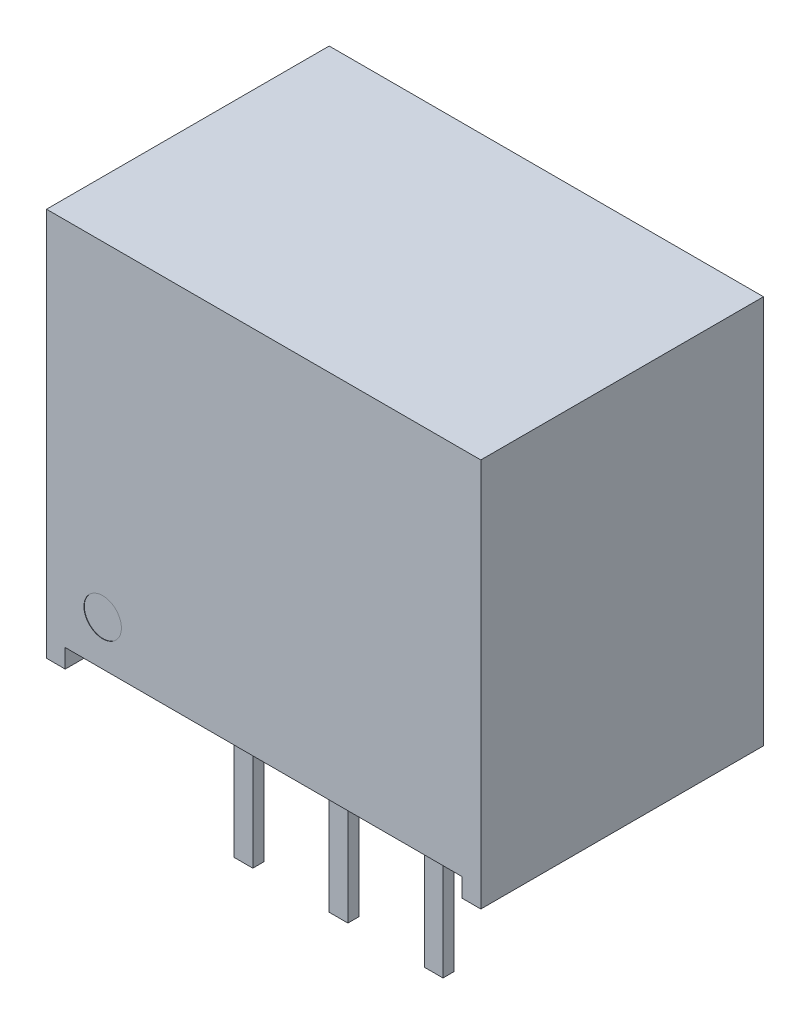
ISO-10303-21;
HEADER;
FILE_DESCRIPTION(('STEP AP214'),'2;1');
FILE_NAME('part.step','',(''),(''),'','','');
FILE_SCHEMA(('AUTOMOTIVE_DESIGN { 1 0 10303 214 1 1 1 1 }'));
ENDSEC;
DATA;
#1=APPLICATION_CONTEXT('core data for automotive mechanical design processes');
#2=APPLICATION_PROTOCOL_DEFINITION('international standard','automotive_design',2000,#1);
#3=PRODUCT_CONTEXT('',#1,'mechanical');
#4=PRODUCT('Part','Part','',(#3));
#5=PRODUCT_RELATED_PRODUCT_CATEGORY('part','',(#4));
#6=PRODUCT_DEFINITION_FORMATION('','',#4);
#7=PRODUCT_DEFINITION_CONTEXT('part definition',#1,'design');
#8=PRODUCT_DEFINITION('design','',#6,#7);
#9=PRODUCT_DEFINITION_SHAPE('','',#8);
#10=(LENGTH_UNIT() NAMED_UNIT(*) SI_UNIT(.MILLI.,.METRE.));
#11=(NAMED_UNIT(*) PLANE_ANGLE_UNIT() SI_UNIT($,.RADIAN.));
#12=(NAMED_UNIT(*) SI_UNIT($,.STERADIAN.) SOLID_ANGLE_UNIT());
#13=UNCERTAINTY_MEASURE_WITH_UNIT(LENGTH_MEASURE(1.E-05),#10,'distance_accuracy_value','');
#14=(GEOMETRIC_REPRESENTATION_CONTEXT(3) GLOBAL_UNCERTAINTY_ASSIGNED_CONTEXT((#13)) GLOBAL_UNIT_ASSIGNED_CONTEXT((#10,
#11,#12)) REPRESENTATION_CONTEXT('',''));
#15=CARTESIAN_POINT('',(0.,0.,0.));
#16=DIRECTION('',(0.,0.,1.));
#17=DIRECTION('',(1.,0.,0.));
#18=AXIS2_PLACEMENT_3D('',#15,#16,#17);
#19=CARTESIAN_POINT('',(-0.25,-4.6,5.55));
#20=DIRECTION('',(1.,0.,0.));
#21=DIRECTION('',(0.,0.,-1.));
#22=AXIS2_PLACEMENT_3D('',#19,#20,#21);
#23=PLANE('',#22);
#24=DIRECTION('',(0.,1.,0.));
#25=VECTOR('',#24,1.);
#26=CARTESIAN_POINT('',(-0.249999999999999,-4.6,5.25));
#27=LINE('',#26,#25);
#28=CARTESIAN_POINT('',(-0.25,0.,5.25));
#29=VERTEX_POINT('',#28);
#30=CARTESIAN_POINT('',(-0.249999999999999,-4.6,5.25));
#31=VERTEX_POINT('',#30);
#32=EDGE_CURVE('P0_E140',#29,#31,#27,.F.);
#33=ORIENTED_EDGE('',*,*,#32,.T.);
#34=DIRECTION('',(0.,0.,-1.));
#35=VECTOR('',#34,1.);
#36=CARTESIAN_POINT('',(-0.25,-4.6,0.));
#37=LINE('',#36,#35);
#38=CARTESIAN_POINT('',(-0.25,-4.6,5.55));
#39=VERTEX_POINT('',#38);
#40=EDGE_CURVE('P0_E319',#39,#31,#37,.T.);
#41=ORIENTED_EDGE('',*,*,#40,.F.);
#42=DIRECTION('',(0.,1.,0.));
#43=VECTOR('',#42,1.);
#44=CARTESIAN_POINT('',(-0.25,-4.6,5.55));
#45=LINE('',#44,#43);
#46=CARTESIAN_POINT('',(-0.25,0.,5.55));
#47=VERTEX_POINT('',#46);
#48=EDGE_CURVE('P0_E308',#39,#47,#45,.T.);
#49=ORIENTED_EDGE('',*,*,#48,.T.);
#50=DIRECTION('',(0.,0.,-1.));
#51=VECTOR('',#50,1.);
#52=CARTESIAN_POINT('',(-0.25,0.,5.55));
#53=LINE('',#52,#51);
#54=EDGE_CURVE('P0_E143',#29,#47,#53,.F.);
#55=ORIENTED_EDGE('',*,*,#54,.F.);
#56=EDGE_LOOP('',(#33,#41,#49,#55));
#57=FACE_BOUND('',#56,.T.);
#58=ADVANCED_FACE('P0_F39',(#57),#23,.F.);
#59=CARTESIAN_POINT('',(2.29,-4.6,5.55));
#60=DIRECTION('',(1.,0.,0.));
#61=DIRECTION('',(0.,0.,-1.));
#62=AXIS2_PLACEMENT_3D('',#59,#60,#61);
#63=PLANE('',#62);
#64=DIRECTION('',(0.,1.,0.));
#65=VECTOR('',#64,1.);
#66=CARTESIAN_POINT('',(2.29,-4.6,5.25));
#67=LINE('',#66,#65);
#68=CARTESIAN_POINT('',(2.29,0.,5.25));
#69=VERTEX_POINT('',#68);
#70=CARTESIAN_POINT('',(2.29,-4.6,5.25));
#71=VERTEX_POINT('',#70);
#72=EDGE_CURVE('P0_E302',#69,#71,#67,.F.);
#73=ORIENTED_EDGE('',*,*,#72,.T.);
#74=DIRECTION('',(0.,0.,-1.));
#75=VECTOR('',#74,1.);
#76=CARTESIAN_POINT('',(2.29,-4.6,0.));
#77=LINE('',#76,#75);
#78=CARTESIAN_POINT('',(2.29,-4.6,5.55));
#79=VERTEX_POINT('',#78);
#80=EDGE_CURVE('P0_E294',#79,#71,#77,.T.);
#81=ORIENTED_EDGE('',*,*,#80,.F.);
#82=DIRECTION('',(0.,1.,0.));
#83=VECTOR('',#82,1.);
#84=CARTESIAN_POINT('',(2.29,-4.6,5.55));
#85=LINE('',#84,#83);
#86=CARTESIAN_POINT('',(2.29,0.,5.55));
#87=VERTEX_POINT('',#86);
#88=EDGE_CURVE('P0_E282',#79,#87,#85,.T.);
#89=ORIENTED_EDGE('',*,*,#88,.T.);
#90=DIRECTION('',(0.,0.,-1.));
#91=VECTOR('',#90,1.);
#92=CARTESIAN_POINT('',(2.29,0.,5.55));
#93=LINE('',#92,#91);
#94=EDGE_CURVE('P0_E328',#69,#87,#93,.F.);
#95=ORIENTED_EDGE('',*,*,#94,.F.);
#96=EDGE_LOOP('',(#73,#81,#89,#95));
#97=FACE_BOUND('',#96,.T.);
#98=ADVANCED_FACE('P0_F424',(#97),#63,.F.);
#99=CARTESIAN_POINT('',(-4.3,1.2,7.54));
#100=DIRECTION('',(0.,0.,1.));
#101=DIRECTION('',(1.,0.,0.));
#102=AXIS2_PLACEMENT_3D('',#99,#100,#101);
#103=PLANE('',#102);
#104=CARTESIAN_POINT('',(-4.3,1.2,7.54));
#105=DIRECTION('',(0.,0.,1.));
#106=DIRECTION('',(1.,0.,0.));
#107=AXIS2_PLACEMENT_3D('',#104,#105,#106);
#108=CIRCLE('',#107,0.5);
#109=CARTESIAN_POINT('',(-3.8,1.2,7.54));
#110=VERTEX_POINT('',#109);
#111=EDGE_CURVE('P0_E42',#110,#110,#108,.T.);
#112=ORIENTED_EDGE('',*,*,#111,.T.);
#113=EDGE_LOOP('',(#112));
#114=FACE_BOUND('',#113,.T.);
#115=ADVANCED_FACE('P0_F422',(#114),#103,.T.);
#116=CARTESIAN_POINT('',(-0.249999999999999,-4.6,5.25));
#117=DIRECTION('',(0.,0.,1.));
#118=DIRECTION('',(1.,0.,0.));
#119=AXIS2_PLACEMENT_3D('',#116,#117,#118);
#120=PLANE('',#119);
#121=DIRECTION('',(0.,1.,0.));
#122=VECTOR('',#121,1.);
#123=CARTESIAN_POINT('',(0.250000000000001,-4.6,5.25));
#124=LINE('',#123,#122);
#125=CARTESIAN_POINT('',(0.250000000000001,0.,5.25));
#126=VERTEX_POINT('',#125);
#127=CARTESIAN_POINT('',(0.250000000000001,-4.6,5.25));
#128=VERTEX_POINT('',#127);
#129=EDGE_CURVE('P0_E274',#126,#128,#124,.F.);
#130=ORIENTED_EDGE('',*,*,#129,.T.);
#131=DIRECTION('',(1.,0.,0.));
#132=VECTOR('',#131,1.);
#133=CARTESIAN_POINT('',(2.54,-4.6,5.25));
#134=LINE('',#133,#132);
#135=EDGE_CURVE('P0_E315',#31,#128,#134,.T.);
#136=ORIENTED_EDGE('',*,*,#135,.F.);
#137=ORIENTED_EDGE('',*,*,#32,.F.);
#138=DIRECTION('',(1.,0.,0.));
#139=VECTOR('',#138,1.);
#140=CARTESIAN_POINT('',(-0.249999999999999,0.,5.25));
#141=LINE('',#140,#139);
#142=EDGE_CURVE('P0_E323',#126,#29,#141,.F.);
#143=ORIENTED_EDGE('',*,*,#142,.F.);
#144=EDGE_LOOP('',(#130,#136,#137,#143));
#145=FACE_BOUND('',#144,.T.);
#146=ADVANCED_FACE('P0_F374',(#145),#120,.F.);
#147=CARTESIAN_POINT('',(2.54,-4.6,0.));
#148=DIRECTION('',(0.,-1.,0.));
#149=DIRECTION('',(0.,0.,-1.));
#150=AXIS2_PLACEMENT_3D('',#147,#148,#149);
#151=PLANE('',#150);
#152=ORIENTED_EDGE('',*,*,#40,.T.);
#153=ORIENTED_EDGE('',*,*,#135,.T.);
#154=DIRECTION('',(0.,0.,1.));
#155=VECTOR('',#154,1.);
#156=CARTESIAN_POINT('',(0.250000000000001,-4.6,5.55));
#157=LINE('',#156,#155);
#158=CARTESIAN_POINT('',(0.250000000000001,-4.6,5.55));
#159=VERTEX_POINT('',#158);
#160=EDGE_CURVE('P0_E271',#128,#159,#157,.T.);
#161=ORIENTED_EDGE('',*,*,#160,.T.);
#162=DIRECTION('',(-1.,0.,0.));
#163=VECTOR('',#162,1.);
#164=CARTESIAN_POINT('',(-0.25,-4.6,5.55));
#165=LINE('',#164,#163);
#166=EDGE_CURVE('P0_E311',#159,#39,#165,.T.);
#167=ORIENTED_EDGE('',*,*,#166,.T.);
#168=EDGE_LOOP('',(#152,#153,#161,#167));
#169=FACE_BOUND('',#168,.T.);
#170=ADVANCED_FACE('P0_F377',(#169),#151,.T.);
#171=CARTESIAN_POINT('',(-0.25,-4.6,5.55));
#172=DIRECTION('',(0.,0.,-1.));
#173=DIRECTION('',(-1.,0.,0.));
#174=AXIS2_PLACEMENT_3D('',#171,#172,#173);
#175=PLANE('',#174);
#176=ORIENTED_EDGE('',*,*,#48,.F.);
#177=ORIENTED_EDGE('',*,*,#166,.F.);
#178=DIRECTION('',(0.,1.,0.));
#179=VECTOR('',#178,1.);
#180=CARTESIAN_POINT('',(0.250000000000001,-4.6,5.55));
#181=LINE('',#180,#179);
#182=CARTESIAN_POINT('',(0.250000000000001,0.,5.55));
#183=VERTEX_POINT('',#182);
#184=EDGE_CURVE('P0_E267',#159,#183,#181,.T.);
#185=ORIENTED_EDGE('',*,*,#184,.T.);
#186=DIRECTION('',(-1.,0.,0.));
#187=VECTOR('',#186,1.);
#188=CARTESIAN_POINT('',(-0.25,0.,5.55));
#189=LINE('',#188,#187);
#190=EDGE_CURVE('P0_E305',#47,#183,#189,.F.);
#191=ORIENTED_EDGE('',*,*,#190,.F.);
#192=EDGE_LOOP('',(#176,#177,#185,#191));
#193=FACE_BOUND('',#192,.T.);
#194=ADVANCED_FACE('P0_F382',(#193),#175,.F.);
#195=CARTESIAN_POINT('',(2.29,-4.6,5.25));
#196=DIRECTION('',(0.,0.,1.));
#197=DIRECTION('',(1.,0.,0.));
#198=AXIS2_PLACEMENT_3D('',#195,#196,#197);
#199=PLANE('',#198);
#200=DIRECTION('',(0.,1.,0.));
#201=VECTOR('',#200,1.);
#202=CARTESIAN_POINT('',(2.79,-4.6,5.25));
#203=LINE('',#202,#201);
#204=CARTESIAN_POINT('',(2.79,0.,5.25));
#205=VERTEX_POINT('',#204);
#206=CARTESIAN_POINT('',(2.79,-4.6,5.25));
#207=VERTEX_POINT('',#206);
#208=EDGE_CURVE('P0_E255',#205,#207,#203,.F.);
#209=ORIENTED_EDGE('',*,*,#208,.T.);
#210=DIRECTION('',(1.,0.,0.));
#211=VECTOR('',#210,1.);
#212=CARTESIAN_POINT('',(5.08,-4.6,5.25));
#213=LINE('',#212,#211);
#214=EDGE_CURVE('P0_E290',#71,#207,#213,.T.);
#215=ORIENTED_EDGE('',*,*,#214,.F.);
#216=ORIENTED_EDGE('',*,*,#72,.F.);
#217=DIRECTION('',(1.,0.,0.));
#218=VECTOR('',#217,1.);
#219=CARTESIAN_POINT('',(2.29,0.,5.25));
#220=LINE('',#219,#218);
#221=EDGE_CURVE('P0_E298',#205,#69,#220,.F.);
#222=ORIENTED_EDGE('',*,*,#221,.F.);
#223=EDGE_LOOP('',(#209,#215,#216,#222));
#224=FACE_BOUND('',#223,.T.);
#225=ADVANCED_FACE('P0_F411',(#224),#199,.F.);
#226=CARTESIAN_POINT('',(5.08,-4.6,0.));
#227=DIRECTION('',(0.,-1.,0.));
#228=DIRECTION('',(0.,0.,-1.));
#229=AXIS2_PLACEMENT_3D('',#226,#227,#228);
#230=PLANE('',#229);
#231=ORIENTED_EDGE('',*,*,#80,.T.);
#232=ORIENTED_EDGE('',*,*,#214,.T.);
#233=DIRECTION('',(0.,0.,1.));
#234=VECTOR('',#233,1.);
#235=CARTESIAN_POINT('',(2.79,-4.6,5.55));
#236=LINE('',#235,#234);
#237=CARTESIAN_POINT('',(2.79,-4.6,5.55));
#238=VERTEX_POINT('',#237);
#239=EDGE_CURVE('P0_E252',#207,#238,#236,.T.);
#240=ORIENTED_EDGE('',*,*,#239,.T.);
#241=DIRECTION('',(-1.,0.,0.));
#242=VECTOR('',#241,1.);
#243=CARTESIAN_POINT('',(2.29,-4.6,5.55));
#244=LINE('',#243,#242);
#245=EDGE_CURVE('P0_E286',#238,#79,#244,.T.);
#246=ORIENTED_EDGE('',*,*,#245,.T.);
#247=EDGE_LOOP('',(#231,#232,#240,#246));
#248=FACE_BOUND('',#247,.T.);
#249=ADVANCED_FACE('P0_F407',(#248),#230,.T.);
#250=CARTESIAN_POINT('',(2.29,-4.6,5.55));
#251=DIRECTION('',(0.,0.,-1.));
#252=DIRECTION('',(-1.,0.,0.));
#253=AXIS2_PLACEMENT_3D('',#250,#251,#252);
#254=PLANE('',#253);
#255=ORIENTED_EDGE('',*,*,#88,.F.);
#256=ORIENTED_EDGE('',*,*,#245,.F.);
#257=DIRECTION('',(0.,1.,0.));
#258=VECTOR('',#257,1.);
#259=CARTESIAN_POINT('',(2.79,-4.6,5.55));
#260=LINE('',#259,#258);
#261=CARTESIAN_POINT('',(2.79,0.,5.55));
#262=VERTEX_POINT('',#261);
#263=EDGE_CURVE('P0_E248',#238,#262,#260,.T.);
#264=ORIENTED_EDGE('',*,*,#263,.T.);
#265=DIRECTION('',(-1.,0.,0.));
#266=VECTOR('',#265,1.);
#267=CARTESIAN_POINT('',(2.29,0.,5.55));
#268=LINE('',#267,#266);
#269=EDGE_CURVE('P0_E279',#87,#262,#268,.F.);
#270=ORIENTED_EDGE('',*,*,#269,.F.);
#271=EDGE_LOOP('',(#255,#256,#264,#270));
#272=FACE_BOUND('',#271,.T.);
#273=ADVANCED_FACE('P0_F403',(#272),#254,.F.);
#274=CARTESIAN_POINT('',(-4.3,1.2,7.54));
#275=DIRECTION('',(0.,0.,1.));
#276=DIRECTION('',(1.,0.,0.));
#277=AXIS2_PLACEMENT_3D('',#274,#275,#276);
#278=CYLINDRICAL_SURFACE('',#277,0.5);
#279=ORIENTED_EDGE('',*,*,#111,.F.);
#280=EDGE_LOOP('',(#279));
#281=FACE_BOUND('',#280,.T.);
#282=CARTESIAN_POINT('',(-4.3,1.2,7.55));
#283=DIRECTION('',(0.,0.,1.));
#284=DIRECTION('',(1.,0.,0.));
#285=AXIS2_PLACEMENT_3D('',#282,#283,#284);
#286=CIRCLE('',#285,0.5);
#287=CARTESIAN_POINT('',(-3.8,1.2,7.55));
#288=VERTEX_POINT('',#287);
#289=EDGE_CURVE('P0_E241',#288,#288,#286,.T.);
#290=ORIENTED_EDGE('',*,*,#289,.T.);
#291=EDGE_LOOP('',(#290));
#292=FACE_BOUND('',#291,.T.);
#293=ADVANCED_FACE('P0_F336',(#281,#292),#278,.F.);
#294=CARTESIAN_POINT('',(5.3,-0.499999999999999,7.55));
#295=DIRECTION('',(0.,1.,0.));
#296=DIRECTION('',(-1.,0.,0.));
#297=AXIS2_PLACEMENT_3D('',#294,#295,#296);
#298=PLANE('',#297);
#299=DIRECTION('',(0.,0.,1.));
#300=VECTOR('',#299,1.);
#301=CARTESIAN_POINT('',(5.8,-0.499999999999999,7.55));
#302=LINE('',#301,#300);
#303=CARTESIAN_POINT('',(5.8,-0.499999999999999,0.));
#304=VERTEX_POINT('',#303);
#305=CARTESIAN_POINT('',(5.8,-0.499999999999999,7.55));
#306=VERTEX_POINT('',#305);
#307=EDGE_CURVE('P0_E226',#304,#306,#302,.T.);
#308=ORIENTED_EDGE('',*,*,#307,.T.);
#309=DIRECTION('',(-1.,0.,0.));
#310=VECTOR('',#309,1.);
#311=CARTESIAN_POINT('',(5.8,-0.499999999999999,7.55));
#312=LINE('',#311,#310);
#313=CARTESIAN_POINT('',(5.3,-0.499999999999999,7.55));
#314=VERTEX_POINT('',#313);
#315=EDGE_CURVE('P0_E238',#306,#314,#312,.T.);
#316=ORIENTED_EDGE('',*,*,#315,.T.);
#317=DIRECTION('',(0.,0.,-1.));
#318=VECTOR('',#317,1.);
#319=CARTESIAN_POINT('',(5.3,-0.499999999999999,7.55));
#320=LINE('',#319,#318);
#321=CARTESIAN_POINT('',(5.3,-0.499999999999999,0.));
#322=VERTEX_POINT('',#321);
#323=EDGE_CURVE('P0_E260',#314,#322,#320,.T.);
#324=ORIENTED_EDGE('',*,*,#323,.T.);
#325=DIRECTION('',(-1.,0.,0.));
#326=VECTOR('',#325,1.);
#327=CARTESIAN_POINT('',(5.3,-0.499999999999999,0.));
#328=LINE('',#327,#326);
#329=EDGE_CURVE('P0_E276',#304,#322,#328,.T.);
#330=ORIENTED_EDGE('',*,*,#329,.F.);
#331=EDGE_LOOP('',(#308,#316,#324,#330));
#332=FACE_BOUND('',#331,.T.);
#333=ADVANCED_FACE('P0_F388',(#332),#298,.F.);
#334=CARTESIAN_POINT('',(0.250000000000001,-4.6,5.55));
#335=DIRECTION('',(-1.,0.,0.));
#336=DIRECTION('',(0.,0.,1.));
#337=AXIS2_PLACEMENT_3D('',#334,#335,#336);
#338=PLANE('',#337);
#339=ORIENTED_EDGE('',*,*,#184,.F.);
#340=ORIENTED_EDGE('',*,*,#160,.F.);
#341=ORIENTED_EDGE('',*,*,#129,.F.);
#342=DIRECTION('',(0.,0.,1.));
#343=VECTOR('',#342,1.);
#344=CARTESIAN_POINT('',(0.25,0.,7.55));
#345=LINE('',#344,#343);
#346=EDGE_CURVE('P0_E220',#126,#183,#345,.T.);
#347=ORIENTED_EDGE('',*,*,#346,.T.);
#348=EDGE_LOOP('',(#339,#340,#341,#347));
#349=FACE_BOUND('',#348,.T.);
#350=ADVANCED_FACE('P0_F385',(#349),#338,.F.);
#351=CARTESIAN_POINT('',(-5.3,0.,7.55));
#352=DIRECTION('',(-1.,0.,0.));
#353=DIRECTION('',(0.,0.,1.));
#354=AXIS2_PLACEMENT_3D('',#351,#352,#353);
#355=PLANE('',#354);
#356=DIRECTION('',(0.,0.,1.));
#357=VECTOR('',#356,1.);
#358=CARTESIAN_POINT('',(-5.3,0.,7.55));
#359=LINE('',#358,#357);
#360=CARTESIAN_POINT('',(-5.3,0.,0.));
#361=VERTEX_POINT('',#360);
#362=CARTESIAN_POINT('',(-5.3,0.,7.55));
#363=VERTEX_POINT('',#362);
#364=EDGE_CURVE('P0_E217',#361,#363,#359,.T.);
#365=ORIENTED_EDGE('',*,*,#364,.T.);
#366=DIRECTION('',(0.,1.,0.));
#367=VECTOR('',#366,1.);
#368=CARTESIAN_POINT('',(-5.3,9.66,7.55));
#369=LINE('',#368,#367);
#370=CARTESIAN_POINT('',(-5.3,-0.499999999999999,7.55));
#371=VERTEX_POINT('',#370);
#372=EDGE_CURVE('P0_E232',#363,#371,#369,.F.);
#373=ORIENTED_EDGE('',*,*,#372,.T.);
#374=DIRECTION('',(0.,0.,1.));
#375=VECTOR('',#374,1.);
#376=CARTESIAN_POINT('',(-5.3,-0.499999999999999,7.55));
#377=LINE('',#376,#375);
#378=CARTESIAN_POINT('',(-5.3,-0.499999999999999,0.));
#379=VERTEX_POINT('',#378);
#380=EDGE_CURVE('P0_E244',#371,#379,#377,.F.);
#381=ORIENTED_EDGE('',*,*,#380,.T.);
#382=DIRECTION('',(0.,1.,0.));
#383=VECTOR('',#382,1.);
#384=CARTESIAN_POINT('',(-5.3,0.,0.));
#385=LINE('',#384,#383);
#386=EDGE_CURVE('P0_E264',#361,#379,#385,.F.);
#387=ORIENTED_EDGE('',*,*,#386,.F.);
#388=EDGE_LOOP('',(#365,#373,#381,#387));
#389=FACE_BOUND('',#388,.T.);
#390=ADVANCED_FACE('P0_F387',(#389),#355,.F.);
#391=CARTESIAN_POINT('',(5.3,0.,7.55));
#392=DIRECTION('',(1.,0.,0.));
#393=DIRECTION('',(0.,0.,-1.));
#394=AXIS2_PLACEMENT_3D('',#391,#392,#393);
#395=PLANE('',#394);
#396=ORIENTED_EDGE('',*,*,#323,.F.);
#397=DIRECTION('',(0.,1.,0.));
#398=VECTOR('',#397,1.);
#399=CARTESIAN_POINT('',(5.3,9.66,7.55));
#400=LINE('',#399,#398);
#401=CARTESIAN_POINT('',(5.3,0.,7.55));
#402=VERTEX_POINT('',#401);
#403=EDGE_CURVE('P0_E235',#314,#402,#400,.T.);
#404=ORIENTED_EDGE('',*,*,#403,.T.);
#405=DIRECTION('',(0.,0.,1.));
#406=VECTOR('',#405,1.);
#407=CARTESIAN_POINT('',(5.3,0.,7.55));
#408=LINE('',#407,#406);
#409=CARTESIAN_POINT('',(5.3,0.,0.));
#410=VERTEX_POINT('',#409);
#411=EDGE_CURVE('P0_E209',#402,#410,#408,.F.);
#412=ORIENTED_EDGE('',*,*,#411,.T.);
#413=DIRECTION('',(0.,1.,0.));
#414=VECTOR('',#413,1.);
#415=CARTESIAN_POINT('',(5.3,0.,0.));
#416=LINE('',#415,#414);
#417=EDGE_CURVE('P0_E258',#322,#410,#416,.T.);
#418=ORIENTED_EDGE('',*,*,#417,.F.);
#419=EDGE_LOOP('',(#396,#404,#412,#418));
#420=FACE_BOUND('',#419,.T.);
#421=ADVANCED_FACE('P0_F394',(#420),#395,.F.);
#422=CARTESIAN_POINT('',(2.79,-4.6,5.55));
#423=DIRECTION('',(-1.,0.,0.));
#424=DIRECTION('',(0.,0.,1.));
#425=AXIS2_PLACEMENT_3D('',#422,#423,#424);
#426=PLANE('',#425);
#427=ORIENTED_EDGE('',*,*,#263,.F.);
#428=ORIENTED_EDGE('',*,*,#239,.F.);
#429=ORIENTED_EDGE('',*,*,#208,.F.);
#430=DIRECTION('',(0.,0.,1.));
#431=VECTOR('',#430,1.);
#432=CARTESIAN_POINT('',(2.79,0.,7.55));
#433=LINE('',#432,#431);
#434=EDGE_CURVE('P0_E175',#205,#262,#433,.T.);
#435=ORIENTED_EDGE('',*,*,#434,.T.);
#436=EDGE_LOOP('',(#427,#428,#429,#435));
#437=FACE_BOUND('',#436,.T.);
#438=ADVANCED_FACE('P0_F347',(#437),#426,.F.);
#439=CARTESIAN_POINT('',(-5.3,-0.499999999999999,7.55));
#440=DIRECTION('',(0.,1.,0.));
#441=DIRECTION('',(-1.,0.,0.));
#442=AXIS2_PLACEMENT_3D('',#439,#440,#441);
#443=PLANE('',#442);
#444=ORIENTED_EDGE('',*,*,#380,.F.);
#445=DIRECTION('',(-1.,0.,0.));
#446=VECTOR('',#445,1.);
#447=CARTESIAN_POINT('',(5.8,-0.499999999999999,7.55));
#448=LINE('',#447,#446);
#449=CARTESIAN_POINT('',(-5.8,-0.499999999999999,7.55));
#450=VERTEX_POINT('',#449);
#451=EDGE_CURVE('P0_E229',#371,#450,#448,.T.);
#452=ORIENTED_EDGE('',*,*,#451,.T.);
#453=DIRECTION('',(0.,0.,-1.));
#454=VECTOR('',#453,1.);
#455=CARTESIAN_POINT('',(-5.8,-0.499999999999999,7.55));
#456=LINE('',#455,#454);
#457=CARTESIAN_POINT('',(-5.8,-0.499999999999999,0.));
#458=VERTEX_POINT('',#457);
#459=EDGE_CURVE('P0_E171',#450,#458,#456,.T.);
#460=ORIENTED_EDGE('',*,*,#459,.T.);
#461=DIRECTION('',(-1.,0.,0.));
#462=VECTOR('',#461,1.);
#463=CARTESIAN_POINT('',(-5.3,-0.499999999999999,0.));
#464=LINE('',#463,#462);
#465=EDGE_CURVE('P0_E57',#379,#458,#464,.T.);
#466=ORIENTED_EDGE('',*,*,#465,.F.);
#467=EDGE_LOOP('',(#444,#452,#460,#466));
#468=FACE_BOUND('',#467,.T.);
#469=ADVANCED_FACE('P0_F339',(#468),#443,.F.);
#470=CARTESIAN_POINT('',(5.8,9.66,7.55));
#471=DIRECTION('',(0.,0.,-1.));
#472=DIRECTION('',(-1.,0.,0.));
#473=AXIS2_PLACEMENT_3D('',#470,#471,#472);
#474=PLANE('',#473);
#475=DIRECTION('',(0.,1.,0.));
#476=VECTOR('',#475,1.);
#477=CARTESIAN_POINT('',(5.8,-0.499999999999999,7.55));
#478=LINE('',#477,#476);
#479=CARTESIAN_POINT('',(5.8,9.8886,7.55));
#480=VERTEX_POINT('',#479);
#481=EDGE_CURVE('P0_E183',#306,#480,#478,.T.);
#482=ORIENTED_EDGE('',*,*,#481,.T.);
#483=DIRECTION('',(1.,0.,0.));
#484=VECTOR('',#483,1.);
#485=CARTESIAN_POINT('',(-5.8,9.8886,7.55));
#486=LINE('',#485,#484);
#487=CARTESIAN_POINT('',(-5.8,9.8886,7.55));
#488=VERTEX_POINT('',#487);
#489=EDGE_CURVE('P0_E178',#488,#480,#486,.T.);
#490=ORIENTED_EDGE('',*,*,#489,.F.);
#491=DIRECTION('',(0.,1.,0.));
#492=VECTOR('',#491,1.);
#493=CARTESIAN_POINT('',(-5.8,-0.499999999999999,7.55));
#494=LINE('',#493,#492);
#495=EDGE_CURVE('P0_E166',#488,#450,#494,.F.);
#496=ORIENTED_EDGE('',*,*,#495,.T.);
#497=ORIENTED_EDGE('',*,*,#451,.F.);
#498=ORIENTED_EDGE('',*,*,#372,.F.);
#499=DIRECTION('',(1.,0.,0.));
#500=VECTOR('',#499,1.);
#501=CARTESIAN_POINT('',(-5.3,0.,7.55));
#502=LINE('',#501,#500);
#503=EDGE_CURVE('P0_E213',#363,#402,#502,.T.);
#504=ORIENTED_EDGE('',*,*,#503,.T.);
#505=ORIENTED_EDGE('',*,*,#403,.F.);
#506=ORIENTED_EDGE('',*,*,#315,.F.);
#507=EDGE_LOOP('',(#482,#490,#496,#497,#498,#504,#505,#506));
#508=FACE_BOUND('',#507,.T.);
#509=ORIENTED_EDGE('',*,*,#289,.F.);
#510=EDGE_LOOP('',(#509));
#511=FACE_BOUND('',#510,.T.);
#512=ADVANCED_FACE('P0_F179',(#508,#511),#474,.F.);
#513=CARTESIAN_POINT('',(5.8,-0.499999999999999,7.55));
#514=DIRECTION('',(-1.,0.,0.));
#515=DIRECTION('',(0.,0.,1.));
#516=AXIS2_PLACEMENT_3D('',#513,#514,#515);
#517=PLANE('',#516);
#518=DIRECTION('',(0.,1.,0.));
#519=VECTOR('',#518,1.);
#520=CARTESIAN_POINT('',(5.8,9.66,0.));
#521=LINE('',#520,#519);
#522=CARTESIAN_POINT('',(5.8,9.8886,0.));
#523=VERTEX_POINT('',#522);
#524=EDGE_CURVE('P0_E155',#523,#304,#521,.F.);
#525=ORIENTED_EDGE('',*,*,#524,.F.);
#526=DIRECTION('',(0.,0.,-1.));
#527=VECTOR('',#526,1.);
#528=CARTESIAN_POINT('',(5.8,9.8886,0.));
#529=LINE('',#528,#527);
#530=EDGE_CURVE('P0_E186',#480,#523,#529,.T.);
#531=ORIENTED_EDGE('',*,*,#530,.F.);
#532=ORIENTED_EDGE('',*,*,#481,.F.);
#533=ORIENTED_EDGE('',*,*,#307,.F.);
#534=EDGE_LOOP('',(#525,#531,#532,#533));
#535=FACE_BOUND('',#534,.T.);
#536=ADVANCED_FACE('P0_F338',(#535),#517,.F.);
#537=CARTESIAN_POINT('',(-5.3,0.,7.55));
#538=DIRECTION('',(0.,1.,0.));
#539=DIRECTION('',(0.,0.,1.));
#540=AXIS2_PLACEMENT_3D('',#537,#538,#539);
#541=PLANE('',#540);
#542=ORIENTED_EDGE('',*,*,#221,.T.);
#543=ORIENTED_EDGE('',*,*,#94,.T.);
#544=ORIENTED_EDGE('',*,*,#269,.T.);
#545=ORIENTED_EDGE('',*,*,#434,.F.);
#546=EDGE_LOOP('',(#542,#543,#544,#545));
#547=FACE_BOUND('',#546,.T.);
#548=ORIENTED_EDGE('',*,*,#411,.F.);
#549=ORIENTED_EDGE('',*,*,#503,.F.);
#550=ORIENTED_EDGE('',*,*,#364,.F.);
#551=DIRECTION('',(-1.,0.,0.));
#552=VECTOR('',#551,1.);
#553=CARTESIAN_POINT('',(5.8,0.,0.));
#554=LINE('',#553,#552);
#555=EDGE_CURVE('P0_E49',#410,#361,#554,.T.);
#556=ORIENTED_EDGE('',*,*,#555,.F.);
#557=EDGE_LOOP('',(#548,#549,#550,#556));
#558=FACE_BOUND('',#557,.T.);
#559=ORIENTED_EDGE('',*,*,#142,.T.);
#560=ORIENTED_EDGE('',*,*,#54,.T.);
#561=ORIENTED_EDGE('',*,*,#190,.T.);
#562=ORIENTED_EDGE('',*,*,#346,.F.);
#563=EDGE_LOOP('',(#559,#560,#561,#562));
#564=FACE_BOUND('',#563,.T.);
#565=ADVANCED_FACE('P0_F345',(#547,#558,#564),#541,.F.);
#566=CARTESIAN_POINT('',(-5.8,-0.499999999999999,7.55));
#567=DIRECTION('',(1.,0.,0.));
#568=DIRECTION('',(0.,0.,-1.));
#569=AXIS2_PLACEMENT_3D('',#566,#567,#568);
#570=PLANE('',#569);
#571=ORIENTED_EDGE('',*,*,#459,.F.);
#572=ORIENTED_EDGE('',*,*,#495,.F.);
#573=DIRECTION('',(0.,0.,1.));
#574=VECTOR('',#573,1.);
#575=CARTESIAN_POINT('',(-5.8,9.8886,0.));
#576=LINE('',#575,#574);
#577=CARTESIAN_POINT('',(-5.8,9.8886,0.));
#578=VERTEX_POINT('',#577);
#579=EDGE_CURVE('P0_E170',#578,#488,#576,.T.);
#580=ORIENTED_EDGE('',*,*,#579,.F.);
#581=DIRECTION('',(0.,1.,0.));
#582=VECTOR('',#581,1.);
#583=CARTESIAN_POINT('',(-5.8,9.66,0.));
#584=LINE('',#583,#582);
#585=EDGE_CURVE('P0_E11',#458,#578,#584,.T.);
#586=ORIENTED_EDGE('',*,*,#585,.F.);
#587=EDGE_LOOP('',(#571,#572,#580,#586));
#588=FACE_BOUND('',#587,.T.);
#589=ADVANCED_FACE('P0_F168',(#588),#570,.F.);
#590=CARTESIAN_POINT('',(5.8,9.66,0.));
#591=DIRECTION('',(0.,0.,-1.));
#592=DIRECTION('',(-1.,0.,0.));
#593=AXIS2_PLACEMENT_3D('',#590,#591,#592);
#594=PLANE('',#593);
#595=ORIENTED_EDGE('',*,*,#585,.T.);
#596=DIRECTION('',(-1.,0.,0.));
#597=VECTOR('',#596,1.);
#598=CARTESIAN_POINT('',(-5.8,9.8886,0.));
#599=LINE('',#598,#597);
#600=EDGE_CURVE('P0_E189',#523,#578,#599,.T.);
#601=ORIENTED_EDGE('',*,*,#600,.F.);
#602=ORIENTED_EDGE('',*,*,#524,.T.);
#603=ORIENTED_EDGE('',*,*,#329,.T.);
#604=ORIENTED_EDGE('',*,*,#417,.T.);
#605=ORIENTED_EDGE('',*,*,#555,.T.);
#606=ORIENTED_EDGE('',*,*,#386,.T.);
#607=ORIENTED_EDGE('',*,*,#465,.T.);
#608=EDGE_LOOP('',(#595,#601,#602,#603,#604,#605,#606,#607));
#609=FACE_BOUND('',#608,.T.);
#610=ADVANCED_FACE('P0_F350',(#609),#594,.T.);
#611=CARTESIAN_POINT('',(0.,9.8886,0.));
#612=DIRECTION('',(0.,1.,0.));
#613=DIRECTION('',(0.,0.,1.));
#614=AXIS2_PLACEMENT_3D('',#611,#612,#613);
#615=PLANE('',#614);
#616=ORIENTED_EDGE('',*,*,#579,.T.);
#617=ORIENTED_EDGE('',*,*,#489,.T.);
#618=ORIENTED_EDGE('',*,*,#530,.T.);
#619=ORIENTED_EDGE('',*,*,#600,.T.);
#620=EDGE_LOOP('',(#616,#617,#618,#619));
#621=FACE_BOUND('',#620,.T.);
#622=ADVANCED_FACE('P0_F188',(#621),#615,.T.);
#623=CLOSED_SHELL('',(#58,#98,#115,#146,#170,#194,#225,#249,#273,#293,#333,#350,#390,#421,#438,
#469,#512,#536,#565,#589,#610,#622));
#624=MANIFOLD_SOLID_BREP('P0_B2',#623);
#625=CARTESIAN_POINT('',(-2.79,-4.6,5.25));
#626=DIRECTION('',(0.,0.,1.));
#627=DIRECTION('',(1.,0.,0.));
#628=AXIS2_PLACEMENT_3D('',#625,#626,#627);
#629=PLANE('',#628);
#630=DIRECTION('',(0.,1.,0.));
#631=VECTOR('',#630,1.);
#632=CARTESIAN_POINT('',(-2.29,-4.6,5.25));
#633=LINE('',#632,#631);
#634=CARTESIAN_POINT('',(-2.29,0.,5.25));
#635=VERTEX_POINT('',#634);
#636=CARTESIAN_POINT('',(-2.29,-4.6,5.25));
#637=VERTEX_POINT('',#636);
#638=EDGE_CURVE('P1_E59',#635,#637,#633,.F.);
#639=ORIENTED_EDGE('',*,*,#638,.T.);
#640=DIRECTION('',(1.,0.,0.));
#641=VECTOR('',#640,1.);
#642=CARTESIAN_POINT('',(0.,-4.6,5.25));
#643=LINE('',#642,#641);
#644=CARTESIAN_POINT('',(-2.79,-4.6,5.25));
#645=VERTEX_POINT('',#644);
#646=EDGE_CURVE('P1_E56',#645,#637,#643,.T.);
#647=ORIENTED_EDGE('',*,*,#646,.F.);
#648=DIRECTION('',(0.,1.,0.));
#649=VECTOR('',#648,1.);
#650=CARTESIAN_POINT('',(-2.79,-4.6,5.25));
#651=LINE('',#650,#649);
#652=CARTESIAN_POINT('',(-2.79,0.,5.25));
#653=VERTEX_POINT('',#652);
#654=EDGE_CURVE('P1_E84',#645,#653,#651,.T.);
#655=ORIENTED_EDGE('',*,*,#654,.T.);
#656=DIRECTION('',(1.,0.,0.));
#657=VECTOR('',#656,1.);
#658=CARTESIAN_POINT('',(-2.79,0.,5.25));
#659=LINE('',#658,#657);
#660=EDGE_CURVE('P1_E20',#635,#653,#659,.F.);
#661=ORIENTED_EDGE('',*,*,#660,.F.);
#662=EDGE_LOOP('',(#639,#647,#655,#661));
#663=FACE_BOUND('',#662,.T.);
#664=ADVANCED_FACE('P1_F17',(#663),#629,.F.);
#665=CARTESIAN_POINT('',(-2.29,-4.6,5.55));
#666=DIRECTION('',(-1.,0.,0.));
#667=DIRECTION('',(0.,0.,1.));
#668=AXIS2_PLACEMENT_3D('',#665,#666,#667);
#669=PLANE('',#668);
#670=DIRECTION('',(0.,1.,0.));
#671=VECTOR('',#670,1.);
#672=CARTESIAN_POINT('',(-2.29,-4.6,5.55));
#673=LINE('',#672,#671);
#674=CARTESIAN_POINT('',(-2.29,0.,5.55));
#675=VERTEX_POINT('',#674);
#676=CARTESIAN_POINT('',(-2.29,-4.6,5.55));
#677=VERTEX_POINT('',#676);
#678=EDGE_CURVE('P1_E76',#675,#677,#673,.F.);
#679=ORIENTED_EDGE('',*,*,#678,.T.);
#680=DIRECTION('',(0.,0.,-1.));
#681=VECTOR('',#680,1.);
#682=CARTESIAN_POINT('',(-2.29,-4.6,0.));
#683=LINE('',#682,#681);
#684=EDGE_CURVE('P1_E65',#637,#677,#683,.F.);
#685=ORIENTED_EDGE('',*,*,#684,.F.);
#686=ORIENTED_EDGE('',*,*,#638,.F.);
#687=DIRECTION('',(0.,0.,-1.));
#688=VECTOR('',#687,1.);
#689=CARTESIAN_POINT('',(-2.29,0.,0.));
#690=LINE('',#689,#688);
#691=EDGE_CURVE('P1_E89',#635,#675,#690,.F.);
#692=ORIENTED_EDGE('',*,*,#691,.T.);
#693=EDGE_LOOP('',(#679,#685,#686,#692));
#694=FACE_BOUND('',#693,.T.);
#695=ADVANCED_FACE('P1_F75',(#694),#669,.F.);
#696=CARTESIAN_POINT('',(0.,-4.6,0.));
#697=DIRECTION('',(0.,-1.,0.));
#698=DIRECTION('',(0.,0.,-1.));
#699=AXIS2_PLACEMENT_3D('',#696,#697,#698);
#700=PLANE('',#699);
#701=DIRECTION('',(0.,0.,-1.));
#702=VECTOR('',#701,1.);
#703=CARTESIAN_POINT('',(-2.79,-4.6,5.55));
#704=LINE('',#703,#702);
#705=CARTESIAN_POINT('',(-2.79,-4.6,5.55));
#706=VERTEX_POINT('',#705);
#707=EDGE_CURVE('P1_E71',#706,#645,#704,.T.);
#708=ORIENTED_EDGE('',*,*,#707,.T.);
#709=ORIENTED_EDGE('',*,*,#646,.T.);
#710=ORIENTED_EDGE('',*,*,#684,.T.);
#711=DIRECTION('',(-1.,0.,0.));
#712=VECTOR('',#711,1.);
#713=CARTESIAN_POINT('',(-2.79,-4.6,5.55));
#714=LINE('',#713,#712);
#715=EDGE_CURVE('P1_E94',#677,#706,#714,.T.);
#716=ORIENTED_EDGE('',*,*,#715,.T.);
#717=EDGE_LOOP('',(#708,#709,#710,#716));
#718=FACE_BOUND('',#717,.T.);
#719=ADVANCED_FACE('P1_F68',(#718),#700,.T.);
#720=CARTESIAN_POINT('',(-2.79,-4.6,5.55));
#721=DIRECTION('',(1.,0.,0.));
#722=DIRECTION('',(0.,0.,-1.));
#723=AXIS2_PLACEMENT_3D('',#720,#721,#722);
#724=PLANE('',#723);
#725=ORIENTED_EDGE('',*,*,#654,.F.);
#726=ORIENTED_EDGE('',*,*,#707,.F.);
#727=DIRECTION('',(0.,1.,0.));
#728=VECTOR('',#727,1.);
#729=CARTESIAN_POINT('',(-2.79,-4.6,5.55));
#730=LINE('',#729,#728);
#731=CARTESIAN_POINT('',(-2.79,0.,5.55));
#732=VERTEX_POINT('',#731);
#733=EDGE_CURVE('P1_E27',#706,#732,#730,.T.);
#734=ORIENTED_EDGE('',*,*,#733,.T.);
#735=DIRECTION('',(0.,0.,-1.));
#736=VECTOR('',#735,1.);
#737=CARTESIAN_POINT('',(-2.79,0.,0.));
#738=LINE('',#737,#736);
#739=EDGE_CURVE('P1_E35',#732,#653,#738,.T.);
#740=ORIENTED_EDGE('',*,*,#739,.T.);
#741=EDGE_LOOP('',(#725,#726,#734,#740));
#742=FACE_BOUND('',#741,.T.);
#743=ADVANCED_FACE('P1_F101',(#742),#724,.F.);
#744=CARTESIAN_POINT('',(0.,0.,0.));
#745=DIRECTION('',(0.,-1.,0.));
#746=DIRECTION('',(0.,0.,-1.));
#747=AXIS2_PLACEMENT_3D('',#744,#745,#746);
#748=PLANE('',#747);
#749=ORIENTED_EDGE('',*,*,#660,.T.);
#750=ORIENTED_EDGE('',*,*,#739,.F.);
#751=DIRECTION('',(-1.,0.,0.));
#752=VECTOR('',#751,1.);
#753=CARTESIAN_POINT('',(-2.79,0.,5.55));
#754=LINE('',#753,#752);
#755=EDGE_CURVE('P1_E10',#732,#675,#754,.F.);
#756=ORIENTED_EDGE('',*,*,#755,.T.);
#757=ORIENTED_EDGE('',*,*,#691,.F.);
#758=EDGE_LOOP('',(#749,#750,#756,#757));
#759=FACE_BOUND('',#758,.T.);
#760=ADVANCED_FACE('P1_F104',(#759),#748,.F.);
#761=CARTESIAN_POINT('',(-2.79,-4.6,5.55));
#762=DIRECTION('',(0.,0.,-1.));
#763=DIRECTION('',(-1.,0.,0.));
#764=AXIS2_PLACEMENT_3D('',#761,#762,#763);
#765=PLANE('',#764);
#766=ORIENTED_EDGE('',*,*,#733,.F.);
#767=ORIENTED_EDGE('',*,*,#715,.F.);
#768=ORIENTED_EDGE('',*,*,#678,.F.);
#769=ORIENTED_EDGE('',*,*,#755,.F.);
#770=EDGE_LOOP('',(#766,#767,#768,#769));
#771=FACE_BOUND('',#770,.T.);
#772=ADVANCED_FACE('P1_F103',(#771),#765,.F.);
#773=CLOSED_SHELL('',(#664,#695,#719,#743,#760,#772));
#774=MANIFOLD_SOLID_BREP('P1_B1',#773);
#775=ADVANCED_BREP_SHAPE_REPRESENTATION('',(#18,#624,#774),#14);
#776=SHAPE_DEFINITION_REPRESENTATION(#9,#775);
ENDSEC;
END-ISO-10303-21;
